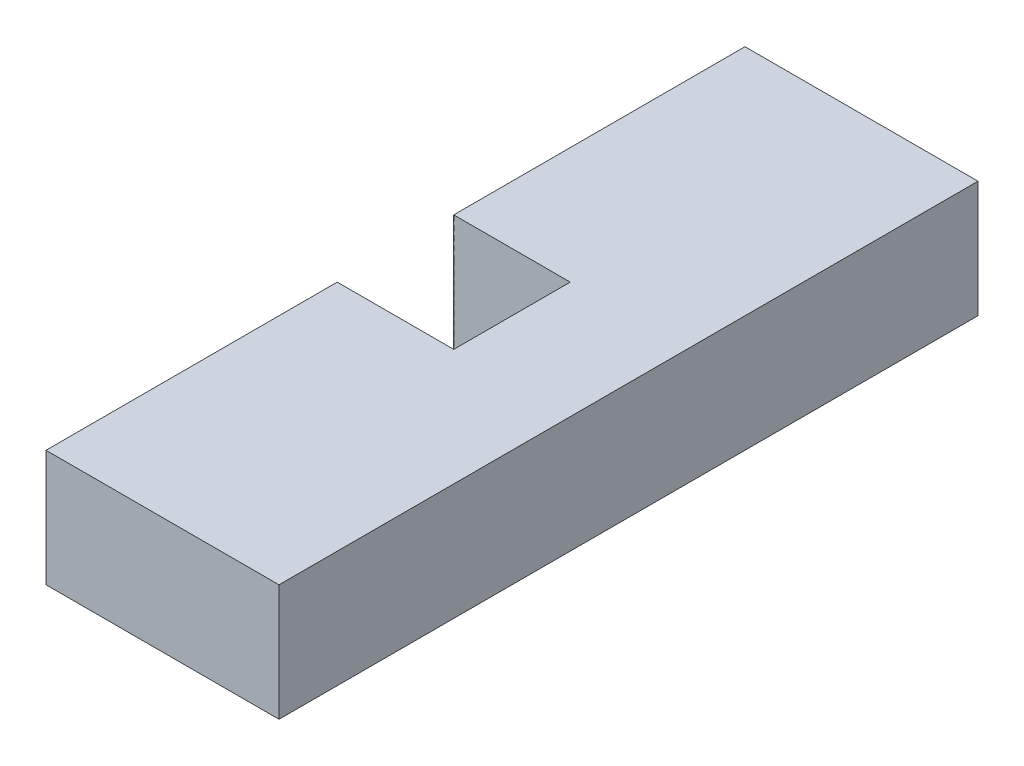
ISO-10303-21;
HEADER;
FILE_DESCRIPTION(('STEP AP214'),'2;1');
FILE_NAME('part.step','',(''),(''),'','','');
FILE_SCHEMA(('AUTOMOTIVE_DESIGN { 1 0 10303 214 1 1 1 1 }'));
ENDSEC;
DATA;
#1=APPLICATION_CONTEXT('core data for automotive mechanical design processes');
#2=APPLICATION_PROTOCOL_DEFINITION('international standard','automotive_design',2000,#1);
#3=PRODUCT_CONTEXT('',#1,'mechanical');
#4=PRODUCT('Part','Part','',(#3));
#5=PRODUCT_RELATED_PRODUCT_CATEGORY('part','',(#4));
#6=PRODUCT_DEFINITION_FORMATION('','',#4);
#7=PRODUCT_DEFINITION_CONTEXT('part definition',#1,'design');
#8=PRODUCT_DEFINITION('design','',#6,#7);
#9=PRODUCT_DEFINITION_SHAPE('','',#8);
#10=(LENGTH_UNIT() NAMED_UNIT(*) SI_UNIT(.MILLI.,.METRE.));
#11=(NAMED_UNIT(*) PLANE_ANGLE_UNIT() SI_UNIT($,.RADIAN.));
#12=(NAMED_UNIT(*) SI_UNIT($,.STERADIAN.) SOLID_ANGLE_UNIT());
#13=UNCERTAINTY_MEASURE_WITH_UNIT(LENGTH_MEASURE(1.E-05),#10,'distance_accuracy_value','');
#14=(GEOMETRIC_REPRESENTATION_CONTEXT(3) GLOBAL_UNCERTAINTY_ASSIGNED_CONTEXT((#13)) GLOBAL_UNIT_ASSIGNED_CONTEXT((#10,
#11,#12)) REPRESENTATION_CONTEXT('',''));
#15=CARTESIAN_POINT('',(0.,0.,0.));
#16=DIRECTION('',(0.,0.,1.));
#17=DIRECTION('',(1.,0.,0.));
#18=AXIS2_PLACEMENT_3D('',#15,#16,#17);
#19=CARTESIAN_POINT('',(-6.35,6.35,-19.05));
#20=DIRECTION('',(1.,0.,0.));
#21=DIRECTION('',(0.,0.,-1.));
#22=AXIS2_PLACEMENT_3D('',#19,#20,#21);
#23=PLANE('',#22);
#24=DIRECTION('',(0.,0.,1.));
#25=VECTOR('',#24,1.);
#26=CARTESIAN_POINT('',(-6.35,0.,-19.05));
#27=LINE('',#26,#25);
#28=CARTESIAN_POINT('',(-6.35,0.,-19.05));
#29=VERTEX_POINT('',#28);
#30=CARTESIAN_POINT('',(-6.35,0.,-3.175));
#31=VERTEX_POINT('',#30);
#32=EDGE_CURVE('E154',#29,#31,#27,.T.);
#33=ORIENTED_EDGE('',*,*,#32,.T.);
#34=DIRECTION('',(0.,1.,0.));
#35=VECTOR('',#34,1.);
#36=CARTESIAN_POINT('',(-6.35,6.35,-3.175));
#37=LINE('',#36,#35);
#38=CARTESIAN_POINT('',(-6.35,6.35,-3.175));
#39=VERTEX_POINT('',#38);
#40=EDGE_CURVE('E121',#31,#39,#37,.T.);
#41=ORIENTED_EDGE('',*,*,#40,.T.);
#42=DIRECTION('',(0.,0.,1.));
#43=VECTOR('',#42,1.);
#44=CARTESIAN_POINT('',(-6.35,6.35,-19.05));
#45=LINE('',#44,#43);
#46=CARTESIAN_POINT('',(-6.35,6.35,-19.05));
#47=VERTEX_POINT('',#46);
#48=EDGE_CURVE('E144',#47,#39,#45,.T.);
#49=ORIENTED_EDGE('',*,*,#48,.F.);
#50=DIRECTION('',(0.,-1.,0.));
#51=VECTOR('',#50,1.);
#52=CARTESIAN_POINT('',(-6.35,6.35,-19.05));
#53=LINE('',#52,#51);
#54=EDGE_CURVE('E160',#47,#29,#53,.T.);
#55=ORIENTED_EDGE('',*,*,#54,.T.);
#56=EDGE_LOOP('',(#33,#41,#49,#55));
#57=FACE_BOUND('',#56,.T.);
#58=ADVANCED_FACE('F33',(#57),#23,.F.);
#59=CARTESIAN_POINT('',(6.35,6.35,-19.05));
#60=DIRECTION('',(-1.,0.,0.));
#61=DIRECTION('',(0.,0.,1.));
#62=AXIS2_PLACEMENT_3D('',#59,#60,#61);
#63=PLANE('',#62);
#64=DIRECTION('',(0.,0.,-1.));
#65=VECTOR('',#64,1.);
#66=CARTESIAN_POINT('',(6.35,0.,-19.05));
#67=LINE('',#66,#65);
#68=CARTESIAN_POINT('',(6.35,0.,19.05));
#69=VERTEX_POINT('',#68);
#70=CARTESIAN_POINT('',(6.35,0.,-19.05));
#71=VERTEX_POINT('',#70);
#72=EDGE_CURVE('E139',#69,#71,#67,.T.);
#73=ORIENTED_EDGE('',*,*,#72,.T.);
#74=DIRECTION('',(0.,-1.,0.));
#75=VECTOR('',#74,1.);
#76=CARTESIAN_POINT('',(6.35,6.35,-19.05));
#77=LINE('',#76,#75);
#78=CARTESIAN_POINT('',(6.35,6.35,-19.05));
#79=VERTEX_POINT('',#78);
#80=EDGE_CURVE('E41',#79,#71,#77,.T.);
#81=ORIENTED_EDGE('',*,*,#80,.F.);
#82=DIRECTION('',(0.,0.,-1.));
#83=VECTOR('',#82,1.);
#84=CARTESIAN_POINT('',(6.35,6.35,-19.05));
#85=LINE('',#84,#83);
#86=CARTESIAN_POINT('',(6.35,6.35,19.05));
#87=VERTEX_POINT('',#86);
#88=EDGE_CURVE('E140',#87,#79,#85,.T.);
#89=ORIENTED_EDGE('',*,*,#88,.F.);
#90=DIRECTION('',(0.,-1.,0.));
#91=VECTOR('',#90,1.);
#92=CARTESIAN_POINT('',(6.35,6.35,19.05));
#93=LINE('',#92,#91);
#94=EDGE_CURVE('E148',#87,#69,#93,.T.);
#95=ORIENTED_EDGE('',*,*,#94,.T.);
#96=EDGE_LOOP('',(#73,#81,#89,#95));
#97=FACE_BOUND('',#96,.T.);
#98=ADVANCED_FACE('F35',(#97),#63,.F.);
#99=CARTESIAN_POINT('',(-6.35,6.35,-19.05));
#100=DIRECTION('',(0.,0.,1.));
#101=DIRECTION('',(1.,0.,0.));
#102=AXIS2_PLACEMENT_3D('',#99,#100,#101);
#103=PLANE('',#102);
#104=DIRECTION('',(-1.,0.,0.));
#105=VECTOR('',#104,1.);
#106=CARTESIAN_POINT('',(-6.35,0.,-19.05));
#107=LINE('',#106,#105);
#108=EDGE_CURVE('E151',#71,#29,#107,.T.);
#109=ORIENTED_EDGE('',*,*,#108,.T.);
#110=ORIENTED_EDGE('',*,*,#54,.F.);
#111=DIRECTION('',(-1.,0.,0.));
#112=VECTOR('',#111,1.);
#113=CARTESIAN_POINT('',(-6.35,6.35,-19.05));
#114=LINE('',#113,#112);
#115=EDGE_CURVE('E86',#79,#47,#114,.T.);
#116=ORIENTED_EDGE('',*,*,#115,.F.);
#117=ORIENTED_EDGE('',*,*,#80,.T.);
#118=EDGE_LOOP('',(#109,#110,#116,#117));
#119=FACE_BOUND('',#118,.T.);
#120=ADVANCED_FACE('F163',(#119),#103,.F.);
#121=CARTESIAN_POINT('',(-6.35,6.35,3.175));
#122=VERTEX_POINT('',#121);
#123=CARTESIAN_POINT('',(-6.35,6.35,19.05));
#124=VERTEX_POINT('',#123);
#125=EDGE_CURVE('E143',#122,#124,#45,.T.);
#126=ORIENTED_EDGE('',*,*,#125,.F.);
#127=DIRECTION('',(0.,-1.,0.));
#128=VECTOR('',#127,1.);
#129=CARTESIAN_POINT('',(-6.35,6.35,3.175));
#130=LINE('',#129,#128);
#131=CARTESIAN_POINT('',(-6.35,0.,3.175));
#132=VERTEX_POINT('',#131);
#133=EDGE_CURVE('E114',#122,#132,#130,.T.);
#134=ORIENTED_EDGE('',*,*,#133,.T.);
#135=CARTESIAN_POINT('',(-6.35,0.,19.05));
#136=VERTEX_POINT('',#135);
#137=EDGE_CURVE('E153',#132,#136,#27,.T.);
#138=ORIENTED_EDGE('',*,*,#137,.T.);
#139=DIRECTION('',(0.,-1.,0.));
#140=VECTOR('',#139,1.);
#141=CARTESIAN_POINT('',(-6.35,6.35,19.05));
#142=LINE('',#141,#140);
#143=EDGE_CURVE('E158',#124,#136,#142,.T.);
#144=ORIENTED_EDGE('',*,*,#143,.F.);
#145=EDGE_LOOP('',(#126,#134,#138,#144));
#146=FACE_BOUND('',#145,.T.);
#147=ADVANCED_FACE('F175',(#146),#23,.F.);
#148=CARTESIAN_POINT('',(-6.35,6.35,19.05));
#149=DIRECTION('',(0.,0.,-1.));
#150=DIRECTION('',(-1.,0.,0.));
#151=AXIS2_PLACEMENT_3D('',#148,#149,#150);
#152=PLANE('',#151);
#153=DIRECTION('',(1.,0.,0.));
#154=VECTOR('',#153,1.);
#155=CARTESIAN_POINT('',(-6.35,0.,19.05));
#156=LINE('',#155,#154);
#157=EDGE_CURVE('E78',#136,#69,#156,.T.);
#158=ORIENTED_EDGE('',*,*,#157,.T.);
#159=ORIENTED_EDGE('',*,*,#94,.F.);
#160=DIRECTION('',(1.,0.,0.));
#161=VECTOR('',#160,1.);
#162=CARTESIAN_POINT('',(-6.35,6.35,19.05));
#163=LINE('',#162,#161);
#164=EDGE_CURVE('E57',#124,#87,#163,.T.);
#165=ORIENTED_EDGE('',*,*,#164,.F.);
#166=ORIENTED_EDGE('',*,*,#143,.T.);
#167=EDGE_LOOP('',(#158,#159,#165,#166));
#168=FACE_BOUND('',#167,.T.);
#169=ADVANCED_FACE('F176',(#168),#152,.F.);
#170=CARTESIAN_POINT('',(0.,6.35,0.));
#171=DIRECTION('',(0.,1.,0.));
#172=DIRECTION('',(0.,0.,1.));
#173=AXIS2_PLACEMENT_3D('',#170,#171,#172);
#174=PLANE('',#173);
#175=DIRECTION('',(-1.,0.,0.));
#176=VECTOR('',#175,1.);
#177=CARTESIAN_POINT('',(0.,6.35,-3.175));
#178=LINE('',#177,#176);
#179=CARTESIAN_POINT('',(0.,6.35,-3.175));
#180=VERTEX_POINT('',#179);
#181=EDGE_CURVE('E128',#180,#39,#178,.T.);
#182=ORIENTED_EDGE('',*,*,#181,.F.);
#183=DIRECTION('',(0.,0.,-1.));
#184=VECTOR('',#183,1.);
#185=CARTESIAN_POINT('',(0.,6.35,-3.175));
#186=LINE('',#185,#184);
#187=CARTESIAN_POINT('',(0.,6.35,3.175));
#188=VERTEX_POINT('',#187);
#189=EDGE_CURVE('E111',#188,#180,#186,.T.);
#190=ORIENTED_EDGE('',*,*,#189,.F.);
#191=DIRECTION('',(1.,0.,0.));
#192=VECTOR('',#191,1.);
#193=CARTESIAN_POINT('',(0.,6.35,3.175));
#194=LINE('',#193,#192);
#195=EDGE_CURVE('E132',#122,#188,#194,.T.);
#196=ORIENTED_EDGE('',*,*,#195,.F.);
#197=ORIENTED_EDGE('',*,*,#125,.T.);
#198=ORIENTED_EDGE('',*,*,#164,.T.);
#199=ORIENTED_EDGE('',*,*,#88,.T.);
#200=ORIENTED_EDGE('',*,*,#115,.T.);
#201=ORIENTED_EDGE('',*,*,#48,.T.);
#202=EDGE_LOOP('',(#182,#190,#196,#197,#198,#199,#200,#201));
#203=FACE_BOUND('',#202,.T.);
#204=ADVANCED_FACE('F169',(#203),#174,.T.);
#205=CARTESIAN_POINT('',(0.,0.,0.));
#206=DIRECTION('',(0.,1.,0.));
#207=DIRECTION('',(0.,0.,1.));
#208=AXIS2_PLACEMENT_3D('',#205,#206,#207);
#209=PLANE('',#208);
#210=DIRECTION('',(0.,0.,-1.));
#211=VECTOR('',#210,1.);
#212=CARTESIAN_POINT('',(0.,0.,-3.175));
#213=LINE('',#212,#211);
#214=CARTESIAN_POINT('',(0.,0.,3.175));
#215=VERTEX_POINT('',#214);
#216=CARTESIAN_POINT('',(0.,0.,-3.175));
#217=VERTEX_POINT('',#216);
#218=EDGE_CURVE('E48',#215,#217,#213,.T.);
#219=ORIENTED_EDGE('',*,*,#218,.T.);
#220=DIRECTION('',(-1.,0.,0.));
#221=VECTOR('',#220,1.);
#222=CARTESIAN_POINT('',(0.,0.,-3.175));
#223=LINE('',#222,#221);
#224=EDGE_CURVE('E118',#217,#31,#223,.T.);
#225=ORIENTED_EDGE('',*,*,#224,.T.);
#226=ORIENTED_EDGE('',*,*,#32,.F.);
#227=ORIENTED_EDGE('',*,*,#108,.F.);
#228=ORIENTED_EDGE('',*,*,#72,.F.);
#229=ORIENTED_EDGE('',*,*,#157,.F.);
#230=ORIENTED_EDGE('',*,*,#137,.F.);
#231=DIRECTION('',(1.,0.,0.));
#232=VECTOR('',#231,1.);
#233=CARTESIAN_POINT('',(0.,0.,3.175));
#234=LINE('',#233,#232);
#235=EDGE_CURVE('E11',#132,#215,#234,.T.);
#236=ORIENTED_EDGE('',*,*,#235,.T.);
#237=EDGE_LOOP('',(#219,#225,#226,#227,#228,#229,#230,#236));
#238=FACE_BOUND('',#237,.T.);
#239=ADVANCED_FACE('F126',(#238),#209,.F.);
#240=CARTESIAN_POINT('',(0.,0.,-3.175));
#241=DIRECTION('',(0.,0.,-1.));
#242=DIRECTION('',(-1.,0.,0.));
#243=AXIS2_PLACEMENT_3D('',#240,#241,#242);
#244=PLANE('',#243);
#245=ORIENTED_EDGE('',*,*,#224,.F.);
#246=DIRECTION('',(0.,1.,0.));
#247=VECTOR('',#246,1.);
#248=CARTESIAN_POINT('',(0.,0.,-3.175));
#249=LINE('',#248,#247);
#250=EDGE_CURVE('E107',#217,#180,#249,.T.);
#251=ORIENTED_EDGE('',*,*,#250,.T.);
#252=ORIENTED_EDGE('',*,*,#181,.T.);
#253=ORIENTED_EDGE('',*,*,#40,.F.);
#254=EDGE_LOOP('',(#245,#251,#252,#253));
#255=FACE_BOUND('',#254,.T.);
#256=ADVANCED_FACE('F119',(#255),#244,.F.);
#257=CARTESIAN_POINT('',(0.,0.,3.175));
#258=DIRECTION('',(0.,0.,1.));
#259=DIRECTION('',(1.,0.,0.));
#260=AXIS2_PLACEMENT_3D('',#257,#258,#259);
#261=PLANE('',#260);
#262=ORIENTED_EDGE('',*,*,#195,.T.);
#263=DIRECTION('',(0.,1.,0.));
#264=VECTOR('',#263,1.);
#265=CARTESIAN_POINT('',(0.,0.,3.175));
#266=LINE('',#265,#264);
#267=EDGE_CURVE('E115',#215,#188,#266,.T.);
#268=ORIENTED_EDGE('',*,*,#267,.F.);
#269=ORIENTED_EDGE('',*,*,#235,.F.);
#270=ORIENTED_EDGE('',*,*,#133,.F.);
#271=EDGE_LOOP('',(#262,#268,#269,#270));
#272=FACE_BOUND('',#271,.T.);
#273=ADVANCED_FACE('F224',(#272),#261,.F.);
#274=CARTESIAN_POINT('',(0.,0.,-3.175));
#275=DIRECTION('',(1.,0.,0.));
#276=DIRECTION('',(0.,0.,-1.));
#277=AXIS2_PLACEMENT_3D('',#274,#275,#276);
#278=PLANE('',#277);
#279=ORIENTED_EDGE('',*,*,#189,.T.);
#280=ORIENTED_EDGE('',*,*,#250,.F.);
#281=ORIENTED_EDGE('',*,*,#218,.F.);
#282=ORIENTED_EDGE('',*,*,#267,.T.);
#283=EDGE_LOOP('',(#279,#280,#281,#282));
#284=FACE_BOUND('',#283,.T.);
#285=ADVANCED_FACE('F109',(#284),#278,.F.);
#286=CLOSED_SHELL('',(#58,#98,#120,#147,#169,#204,#239,#256,#273,#285));
#287=MANIFOLD_SOLID_BREP('B2',#286);
#288=ADVANCED_BREP_SHAPE_REPRESENTATION('',(#18,#287),#14);
#289=SHAPE_DEFINITION_REPRESENTATION(#9,#288);
ENDSEC;
END-ISO-10303-21;
